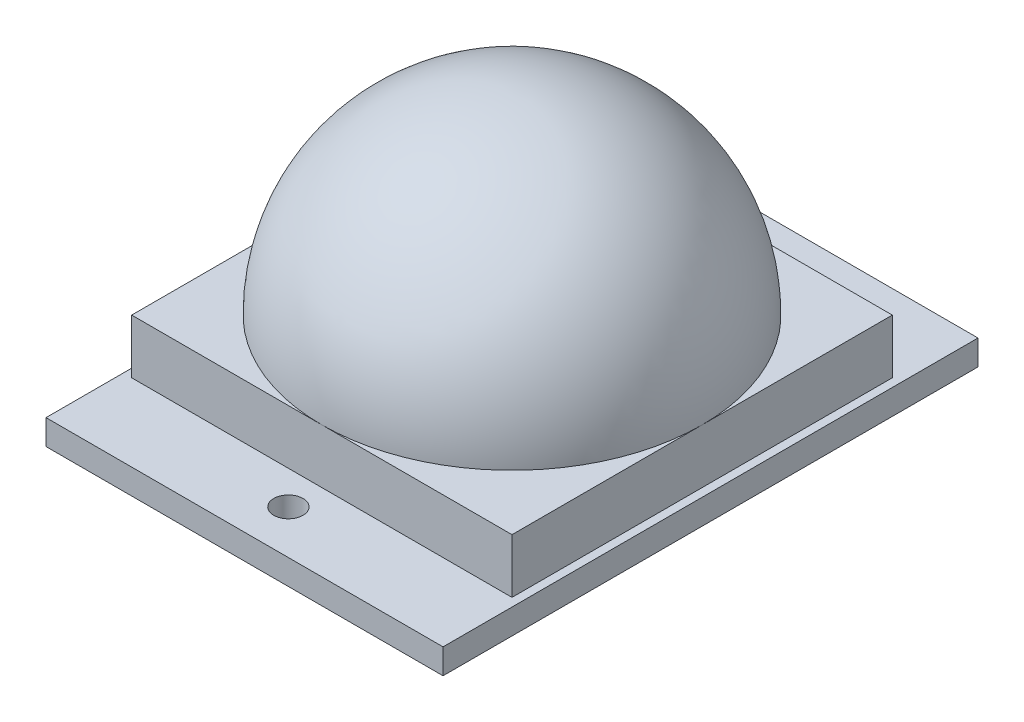
ISO-10303-21;
HEADER;
FILE_DESCRIPTION(('STEP AP214'),'2;1');
FILE_NAME('part.step','',(''),(''),'','','');
FILE_SCHEMA(('AUTOMOTIVE_DESIGN { 1 0 10303 214 1 1 1 1 }'));
ENDSEC;
DATA;
#1=APPLICATION_CONTEXT('core data for automotive mechanical design processes');
#2=APPLICATION_PROTOCOL_DEFINITION('international standard','automotive_design',2000,#1);
#3=PRODUCT_CONTEXT('',#1,'mechanical');
#4=PRODUCT('Part','Part','',(#3));
#5=PRODUCT_RELATED_PRODUCT_CATEGORY('part','',(#4));
#6=PRODUCT_DEFINITION_FORMATION('','',#4);
#7=PRODUCT_DEFINITION_CONTEXT('part definition',#1,'design');
#8=PRODUCT_DEFINITION('design','',#6,#7);
#9=PRODUCT_DEFINITION_SHAPE('','',#8);
#10=(LENGTH_UNIT() NAMED_UNIT(*) SI_UNIT(.MILLI.,.METRE.));
#11=(NAMED_UNIT(*) PLANE_ANGLE_UNIT() SI_UNIT($,.RADIAN.));
#12=(NAMED_UNIT(*) SI_UNIT($,.STERADIAN.) SOLID_ANGLE_UNIT());
#13=UNCERTAINTY_MEASURE_WITH_UNIT(LENGTH_MEASURE(1.E-05),#10,'distance_accuracy_value','');
#14=(GEOMETRIC_REPRESENTATION_CONTEXT(3) GLOBAL_UNCERTAINTY_ASSIGNED_CONTEXT((#13)) GLOBAL_UNIT_ASSIGNED_CONTEXT((#10,
#11,#12)) REPRESENTATION_CONTEXT('',''));
#15=CARTESIAN_POINT('',(0.,0.,0.));
#16=DIRECTION('',(0.,0.,1.));
#17=DIRECTION('',(1.,0.,0.));
#18=AXIS2_PLACEMENT_3D('',#15,#16,#17);
#19=CARTESIAN_POINT('',(0.,4.826,0.));
#20=DIRECTION('',(0.,-1.,0.));
#21=DIRECTION('',(0.,0.,-1.));
#22=AXIS2_PLACEMENT_3D('',#19,#20,#21);
#23=PLANE('',#22);
#24=CARTESIAN_POINT('',(0.,4.826,0.));
#25=DIRECTION('',(0.,-1.,0.));
#26=DIRECTION('',(0.,0.,-1.));
#27=AXIS2_PLACEMENT_3D('',#24,#25,#26);
#28=CIRCLE('',#27,11.557);
#29=CARTESIAN_POINT('',(0.,4.826,-11.557));
#30=VERTEX_POINT('',#29);
#31=CARTESIAN_POINT('',(-11.557,4.826,0.));
#32=VERTEX_POINT('',#31);
#33=EDGE_CURVE('E11',#30,#32,#28,.F.);
#34=ORIENTED_EDGE('',*,*,#33,.F.);
#35=DIRECTION('',(-1.,0.,0.));
#36=VECTOR('',#35,1.);
#37=CARTESIAN_POINT('',(11.557,4.826,-11.557));
#38=LINE('',#37,#36);
#39=CARTESIAN_POINT('',(-11.557,4.826,-11.557));
#40=VERTEX_POINT('',#39);
#41=EDGE_CURVE('E119',#30,#40,#38,.T.);
#42=ORIENTED_EDGE('',*,*,#41,.T.);
#43=DIRECTION('',(0.,0.,1.));
#44=VECTOR('',#43,1.);
#45=CARTESIAN_POINT('',(-11.557,4.826,-11.557));
#46=LINE('',#45,#44);
#47=EDGE_CURVE('E130',#40,#32,#46,.T.);
#48=ORIENTED_EDGE('',*,*,#47,.T.);
#49=EDGE_LOOP('',(#34,#42,#48));
#50=FACE_BOUND('',#49,.T.);
#51=ADVANCED_FACE('F35',(#50),#23,.F.);
#52=CARTESIAN_POINT('',(0.,4.826,11.557));
#53=VERTEX_POINT('',#52);
#54=EDGE_CURVE('E43',#32,#53,#28,.F.);
#55=ORIENTED_EDGE('',*,*,#54,.F.);
#56=CARTESIAN_POINT('',(-11.557,4.826,11.557));
#57=VERTEX_POINT('',#56);
#58=EDGE_CURVE('E149',#32,#57,#46,.T.);
#59=ORIENTED_EDGE('',*,*,#58,.T.);
#60=DIRECTION('',(1.,0.,0.));
#61=VECTOR('',#60,1.);
#62=CARTESIAN_POINT('',(11.557,4.826,11.557));
#63=LINE('',#62,#61);
#64=EDGE_CURVE('E150',#57,#53,#63,.T.);
#65=ORIENTED_EDGE('',*,*,#64,.T.);
#66=EDGE_LOOP('',(#55,#59,#65));
#67=FACE_BOUND('',#66,.T.);
#68=ADVANCED_FACE('F202',(#67),#23,.F.);
#69=CARTESIAN_POINT('',(11.557,4.826,0.));
#70=VERTEX_POINT('',#69);
#71=EDGE_CURVE('E44',#53,#70,#28,.F.);
#72=ORIENTED_EDGE('',*,*,#71,.F.);
#73=CARTESIAN_POINT('',(11.557,4.826,11.557));
#74=VERTEX_POINT('',#73);
#75=EDGE_CURVE('E148',#53,#74,#63,.T.);
#76=ORIENTED_EDGE('',*,*,#75,.T.);
#77=DIRECTION('',(0.,0.,-1.));
#78=VECTOR('',#77,1.);
#79=CARTESIAN_POINT('',(11.557,4.826,-11.557));
#80=LINE('',#79,#78);
#81=EDGE_CURVE('E129',#74,#70,#80,.T.);
#82=ORIENTED_EDGE('',*,*,#81,.T.);
#83=EDGE_LOOP('',(#72,#76,#82));
#84=FACE_BOUND('',#83,.T.);
#85=ADVANCED_FACE('F211',(#84),#23,.F.);
#86=CARTESIAN_POINT('',(0.,1.524,0.));
#87=DIRECTION('',(0.,-1.,0.));
#88=DIRECTION('',(0.,0.,-1.));
#89=AXIS2_PLACEMENT_3D('',#86,#87,#88);
#90=PLANE('',#89);
#91=CARTESIAN_POINT('',(0.,1.524,13.589));
#92=DIRECTION('',(0.,1.,0.));
#93=DIRECTION('',(0.,0.,1.));
#94=AXIS2_PLACEMENT_3D('',#91,#92,#93);
#95=CIRCLE('',#94,0.888999999999999);
#96=CARTESIAN_POINT('',(0.,1.524,14.478));
#97=VERTEX_POINT('',#96);
#98=EDGE_CURVE('E141',#97,#97,#95,.T.);
#99=ORIENTED_EDGE('',*,*,#98,.F.);
#100=EDGE_LOOP('',(#99));
#101=FACE_BOUND('',#100,.T.);
#102=CARTESIAN_POINT('',(0.,1.524,-13.589));
#103=DIRECTION('',(0.,1.,0.));
#104=DIRECTION('',(0.,0.,1.));
#105=AXIS2_PLACEMENT_3D('',#102,#103,#104);
#106=CIRCLE('',#105,0.889000000000001);
#107=CARTESIAN_POINT('',(0.,1.524,-12.7));
#108=VERTEX_POINT('',#107);
#109=EDGE_CURVE('E145',#108,#108,#106,.T.);
#110=ORIENTED_EDGE('',*,*,#109,.F.);
#111=EDGE_LOOP('',(#110));
#112=FACE_BOUND('',#111,.T.);
#113=DIRECTION('',(0.,0.,-1.));
#114=VECTOR('',#113,1.);
#115=CARTESIAN_POINT('',(12.065,1.524,16.256));
#116=LINE('',#115,#114);
#117=CARTESIAN_POINT('',(12.065,1.524,16.256));
#118=VERTEX_POINT('',#117);
#119=CARTESIAN_POINT('',(12.065,1.524,-16.256));
#120=VERTEX_POINT('',#119);
#121=EDGE_CURVE('E171',#118,#120,#116,.T.);
#122=ORIENTED_EDGE('',*,*,#121,.T.);
#123=DIRECTION('',(-1.,0.,0.));
#124=VECTOR('',#123,1.);
#125=CARTESIAN_POINT('',(-12.065,1.524,-16.256));
#126=LINE('',#125,#124);
#127=CARTESIAN_POINT('',(-12.065,1.524,-16.256));
#128=VERTEX_POINT('',#127);
#129=EDGE_CURVE('E174',#120,#128,#126,.T.);
#130=ORIENTED_EDGE('',*,*,#129,.T.);
#131=DIRECTION('',(0.,0.,1.));
#132=VECTOR('',#131,1.);
#133=CARTESIAN_POINT('',(-12.065,1.524,16.256));
#134=LINE('',#133,#132);
#135=CARTESIAN_POINT('',(-12.065,1.524,16.256));
#136=VERTEX_POINT('',#135);
#137=EDGE_CURVE('E177',#128,#136,#134,.T.);
#138=ORIENTED_EDGE('',*,*,#137,.T.);
#139=DIRECTION('',(1.,0.,0.));
#140=VECTOR('',#139,1.);
#141=CARTESIAN_POINT('',(-12.065,1.524,16.256));
#142=LINE('',#141,#140);
#143=EDGE_CURVE('E179',#136,#118,#142,.T.);
#144=ORIENTED_EDGE('',*,*,#143,.T.);
#145=EDGE_LOOP('',(#122,#130,#138,#144));
#146=FACE_BOUND('',#145,.T.);
#147=DIRECTION('',(0.,0.,1.));
#148=VECTOR('',#147,1.);
#149=CARTESIAN_POINT('',(-11.557,1.524,-11.557));
#150=LINE('',#149,#148);
#151=CARTESIAN_POINT('',(-11.557,1.524,-11.557));
#152=VERTEX_POINT('',#151);
#153=CARTESIAN_POINT('',(-11.557,1.524,11.557));
#154=VERTEX_POINT('',#153);
#155=EDGE_CURVE('E134',#152,#154,#150,.T.);
#156=ORIENTED_EDGE('',*,*,#155,.F.);
#157=DIRECTION('',(-1.,0.,0.));
#158=VECTOR('',#157,1.);
#159=CARTESIAN_POINT('',(11.557,1.524,-11.557));
#160=LINE('',#159,#158);
#161=CARTESIAN_POINT('',(11.557,1.524,-11.557));
#162=VERTEX_POINT('',#161);
#163=EDGE_CURVE('E159',#162,#152,#160,.T.);
#164=ORIENTED_EDGE('',*,*,#163,.F.);
#165=DIRECTION('',(0.,0.,-1.));
#166=VECTOR('',#165,1.);
#167=CARTESIAN_POINT('',(11.557,1.524,-11.557));
#168=LINE('',#167,#166);
#169=CARTESIAN_POINT('',(11.557,1.524,11.557));
#170=VERTEX_POINT('',#169);
#171=EDGE_CURVE('E156',#170,#162,#168,.T.);
#172=ORIENTED_EDGE('',*,*,#171,.F.);
#173=DIRECTION('',(1.,0.,0.));
#174=VECTOR('',#173,1.);
#175=CARTESIAN_POINT('',(11.557,1.524,11.557));
#176=LINE('',#175,#174);
#177=EDGE_CURVE('E138',#154,#170,#176,.T.);
#178=ORIENTED_EDGE('',*,*,#177,.F.);
#179=EDGE_LOOP('',(#156,#164,#172,#178));
#180=FACE_BOUND('',#179,.T.);
#181=ADVANCED_FACE('F215',(#101,#112,#146,#180),#90,.F.);
#182=CARTESIAN_POINT('',(12.065,1.524,16.256));
#183=DIRECTION('',(-1.,0.,0.));
#184=DIRECTION('',(0.,0.,1.));
#185=AXIS2_PLACEMENT_3D('',#182,#183,#184);
#186=PLANE('',#185);
#187=DIRECTION('',(0.,0.,-1.));
#188=VECTOR('',#187,1.);
#189=CARTESIAN_POINT('',(12.065,0.,16.256));
#190=LINE('',#189,#188);
#191=CARTESIAN_POINT('',(12.065,0.,16.256));
#192=VERTEX_POINT('',#191);
#193=CARTESIAN_POINT('',(12.065,0.,-16.256));
#194=VERTEX_POINT('',#193);
#195=EDGE_CURVE('E170',#192,#194,#190,.T.);
#196=ORIENTED_EDGE('',*,*,#195,.T.);
#197=DIRECTION('',(0.,-1.,0.));
#198=VECTOR('',#197,1.);
#199=CARTESIAN_POINT('',(12.065,1.524,-16.256));
#200=LINE('',#199,#198);
#201=EDGE_CURVE('E196',#120,#194,#200,.T.);
#202=ORIENTED_EDGE('',*,*,#201,.F.);
#203=ORIENTED_EDGE('',*,*,#121,.F.);
#204=DIRECTION('',(0.,-1.,0.));
#205=VECTOR('',#204,1.);
#206=CARTESIAN_POINT('',(12.065,1.524,16.256));
#207=LINE('',#206,#205);
#208=EDGE_CURVE('E181',#118,#192,#207,.T.);
#209=ORIENTED_EDGE('',*,*,#208,.T.);
#210=EDGE_LOOP('',(#196,#202,#203,#209));
#211=FACE_BOUND('',#210,.T.);
#212=ADVANCED_FACE('F37',(#211),#186,.F.);
#213=CARTESIAN_POINT('',(-12.065,1.524,-16.256));
#214=DIRECTION('',(0.,0.,1.));
#215=DIRECTION('',(1.,0.,0.));
#216=AXIS2_PLACEMENT_3D('',#213,#214,#215);
#217=PLANE('',#216);
#218=DIRECTION('',(-1.,0.,0.));
#219=VECTOR('',#218,1.);
#220=CARTESIAN_POINT('',(-12.065,0.,-16.256));
#221=LINE('',#220,#219);
#222=CARTESIAN_POINT('',(-12.065,0.,-16.256));
#223=VERTEX_POINT('',#222);
#224=EDGE_CURVE('E184',#194,#223,#221,.T.);
#225=ORIENTED_EDGE('',*,*,#224,.T.);
#226=DIRECTION('',(0.,-1.,0.));
#227=VECTOR('',#226,1.);
#228=CARTESIAN_POINT('',(-12.065,1.524,-16.256));
#229=LINE('',#228,#227);
#230=EDGE_CURVE('E194',#128,#223,#229,.T.);
#231=ORIENTED_EDGE('',*,*,#230,.F.);
#232=ORIENTED_EDGE('',*,*,#129,.F.);
#233=ORIENTED_EDGE('',*,*,#201,.T.);
#234=EDGE_LOOP('',(#225,#231,#232,#233));
#235=FACE_BOUND('',#234,.T.);
#236=ADVANCED_FACE('F223',(#235),#217,.F.);
#237=CARTESIAN_POINT('',(-12.065,1.524,16.256));
#238=DIRECTION('',(1.,0.,0.));
#239=DIRECTION('',(0.,0.,-1.));
#240=AXIS2_PLACEMENT_3D('',#237,#238,#239);
#241=PLANE('',#240);
#242=DIRECTION('',(0.,0.,1.));
#243=VECTOR('',#242,1.);
#244=CARTESIAN_POINT('',(-12.065,0.,16.256));
#245=LINE('',#244,#243);
#246=CARTESIAN_POINT('',(-12.065,0.,16.256));
#247=VERTEX_POINT('',#246);
#248=EDGE_CURVE('E186',#223,#247,#245,.T.);
#249=ORIENTED_EDGE('',*,*,#248,.T.);
#250=DIRECTION('',(0.,-1.,0.));
#251=VECTOR('',#250,1.);
#252=CARTESIAN_POINT('',(-12.065,1.524,16.256));
#253=LINE('',#252,#251);
#254=EDGE_CURVE('E191',#136,#247,#253,.T.);
#255=ORIENTED_EDGE('',*,*,#254,.F.);
#256=ORIENTED_EDGE('',*,*,#137,.F.);
#257=ORIENTED_EDGE('',*,*,#230,.T.);
#258=EDGE_LOOP('',(#249,#255,#256,#257));
#259=FACE_BOUND('',#258,.T.);
#260=ADVANCED_FACE('F258',(#259),#241,.F.);
#261=CARTESIAN_POINT('',(-12.065,1.524,16.256));
#262=DIRECTION('',(0.,0.,-1.));
#263=DIRECTION('',(-1.,0.,0.));
#264=AXIS2_PLACEMENT_3D('',#261,#262,#263);
#265=PLANE('',#264);
#266=DIRECTION('',(1.,0.,0.));
#267=VECTOR('',#266,1.);
#268=CARTESIAN_POINT('',(-12.065,0.,16.256));
#269=LINE('',#268,#267);
#270=EDGE_CURVE('E175',#247,#192,#269,.T.);
#271=ORIENTED_EDGE('',*,*,#270,.T.);
#272=ORIENTED_EDGE('',*,*,#208,.F.);
#273=ORIENTED_EDGE('',*,*,#143,.F.);
#274=ORIENTED_EDGE('',*,*,#254,.T.);
#275=EDGE_LOOP('',(#271,#272,#273,#274));
#276=FACE_BOUND('',#275,.T.);
#277=ADVANCED_FACE('F253',(#276),#265,.F.);
#278=CARTESIAN_POINT('',(0.,0.,0.));
#279=DIRECTION('',(0.,-1.,0.));
#280=DIRECTION('',(0.,0.,-1.));
#281=AXIS2_PLACEMENT_3D('',#278,#279,#280);
#282=PLANE('',#281);
#283=CARTESIAN_POINT('',(0.,0.,13.589));
#284=DIRECTION('',(0.,1.,0.));
#285=DIRECTION('',(0.,0.,1.));
#286=AXIS2_PLACEMENT_3D('',#283,#284,#285);
#287=CIRCLE('',#286,0.888999999999999);
#288=CARTESIAN_POINT('',(0.,0.,14.478));
#289=VERTEX_POINT('',#288);
#290=EDGE_CURVE('E135',#289,#289,#287,.T.);
#291=ORIENTED_EDGE('',*,*,#290,.T.);
#292=EDGE_LOOP('',(#291));
#293=FACE_BOUND('',#292,.T.);
#294=CARTESIAN_POINT('',(0.,0.,-13.589));
#295=DIRECTION('',(0.,1.,0.));
#296=DIRECTION('',(0.,0.,1.));
#297=AXIS2_PLACEMENT_3D('',#294,#295,#296);
#298=CIRCLE('',#297,0.889000000000001);
#299=CARTESIAN_POINT('',(0.,0.,-12.7));
#300=VERTEX_POINT('',#299);
#301=EDGE_CURVE('E376',#300,#300,#298,.T.);
#302=ORIENTED_EDGE('',*,*,#301,.T.);
#303=EDGE_LOOP('',(#302));
#304=FACE_BOUND('',#303,.T.);
#305=ORIENTED_EDGE('',*,*,#195,.F.);
#306=ORIENTED_EDGE('',*,*,#270,.F.);
#307=ORIENTED_EDGE('',*,*,#248,.F.);
#308=ORIENTED_EDGE('',*,*,#224,.F.);
#309=EDGE_LOOP('',(#305,#306,#307,#308));
#310=FACE_BOUND('',#309,.T.);
#311=ADVANCED_FACE('F249',(#293,#304,#310),#282,.T.);
#312=CARTESIAN_POINT('',(-11.557,4.826,-11.557));
#313=DIRECTION('',(1.,0.,0.));
#314=DIRECTION('',(0.,0.,-1.));
#315=AXIS2_PLACEMENT_3D('',#312,#313,#314);
#316=PLANE('',#315);
#317=ORIENTED_EDGE('',*,*,#155,.T.);
#318=DIRECTION('',(0.,-1.,0.));
#319=VECTOR('',#318,1.);
#320=CARTESIAN_POINT('',(-11.557,4.826,11.557));
#321=LINE('',#320,#319);
#322=EDGE_CURVE('E167',#57,#154,#321,.T.);
#323=ORIENTED_EDGE('',*,*,#322,.F.);
#324=ORIENTED_EDGE('',*,*,#58,.F.);
#325=ORIENTED_EDGE('',*,*,#47,.F.);
#326=DIRECTION('',(0.,-1.,0.));
#327=VECTOR('',#326,1.);
#328=CARTESIAN_POINT('',(-11.557,4.826,-11.557));
#329=LINE('',#328,#327);
#330=EDGE_CURVE('E118',#40,#152,#329,.T.);
#331=ORIENTED_EDGE('',*,*,#330,.T.);
#332=EDGE_LOOP('',(#317,#323,#324,#325,#331));
#333=FACE_BOUND('',#332,.T.);
#334=ADVANCED_FACE('F206',(#333),#316,.F.);
#335=CARTESIAN_POINT('',(11.557,4.826,11.557));
#336=DIRECTION('',(0.,0.,-1.));
#337=DIRECTION('',(-1.,0.,0.));
#338=AXIS2_PLACEMENT_3D('',#335,#336,#337);
#339=PLANE('',#338);
#340=ORIENTED_EDGE('',*,*,#177,.T.);
#341=DIRECTION('',(0.,-1.,0.));
#342=VECTOR('',#341,1.);
#343=CARTESIAN_POINT('',(11.557,4.826,11.557));
#344=LINE('',#343,#342);
#345=EDGE_CURVE('E164',#74,#170,#344,.T.);
#346=ORIENTED_EDGE('',*,*,#345,.F.);
#347=ORIENTED_EDGE('',*,*,#75,.F.);
#348=ORIENTED_EDGE('',*,*,#64,.F.);
#349=ORIENTED_EDGE('',*,*,#322,.T.);
#350=EDGE_LOOP('',(#340,#346,#347,#348,#349));
#351=FACE_BOUND('',#350,.T.);
#352=ADVANCED_FACE('F208',(#351),#339,.F.);
#353=CARTESIAN_POINT('',(11.557,4.826,-11.557));
#354=DIRECTION('',(-1.,0.,0.));
#355=DIRECTION('',(0.,0.,1.));
#356=AXIS2_PLACEMENT_3D('',#353,#354,#355);
#357=PLANE('',#356);
#358=ORIENTED_EDGE('',*,*,#171,.T.);
#359=DIRECTION('',(0.,-1.,0.));
#360=VECTOR('',#359,1.);
#361=CARTESIAN_POINT('',(11.557,4.826,-11.557));
#362=LINE('',#361,#360);
#363=CARTESIAN_POINT('',(11.557,4.826,-11.557));
#364=VERTEX_POINT('',#363);
#365=EDGE_CURVE('E162',#364,#162,#362,.T.);
#366=ORIENTED_EDGE('',*,*,#365,.F.);
#367=EDGE_CURVE('E114',#70,#364,#80,.T.);
#368=ORIENTED_EDGE('',*,*,#367,.F.);
#369=ORIENTED_EDGE('',*,*,#81,.F.);
#370=ORIENTED_EDGE('',*,*,#345,.T.);
#371=EDGE_LOOP('',(#358,#366,#368,#369,#370));
#372=FACE_BOUND('',#371,.T.);
#373=ADVANCED_FACE('F213',(#372),#357,.F.);
#374=CARTESIAN_POINT('',(11.557,4.826,-11.557));
#375=DIRECTION('',(0.,0.,1.));
#376=DIRECTION('',(1.,0.,0.));
#377=AXIS2_PLACEMENT_3D('',#374,#375,#376);
#378=PLANE('',#377);
#379=ORIENTED_EDGE('',*,*,#163,.T.);
#380=ORIENTED_EDGE('',*,*,#330,.F.);
#381=ORIENTED_EDGE('',*,*,#41,.F.);
#382=EDGE_CURVE('E111',#364,#30,#38,.T.);
#383=ORIENTED_EDGE('',*,*,#382,.F.);
#384=ORIENTED_EDGE('',*,*,#365,.T.);
#385=EDGE_LOOP('',(#379,#380,#381,#383,#384));
#386=FACE_BOUND('',#385,.T.);
#387=ADVANCED_FACE('F124',(#386),#378,.F.);
#388=CARTESIAN_POINT('',(0.,4.826,0.));
#389=DIRECTION('',(0.,-1.,0.));
#390=DIRECTION('',(0.,0.,-1.));
#391=AXIS2_PLACEMENT_3D('',#388,#389,#390);
#392=CIRCLE('',#391,11.557);
#393=EDGE_CURVE('E51',#30,#70,#392,.T.);
#394=ORIENTED_EDGE('',*,*,#393,.T.);
#395=ORIENTED_EDGE('',*,*,#367,.T.);
#396=ORIENTED_EDGE('',*,*,#382,.T.);
#397=EDGE_LOOP('',(#394,#395,#396));
#398=FACE_BOUND('',#397,.T.);
#399=ADVANCED_FACE('F113',(#398),#23,.F.);
#400=CARTESIAN_POINT('',(0.,4.826,0.));
#401=DIRECTION('',(0.,-1.,0.));
#402=DIRECTION('',(0.,0.,1.));
#403=AXIS2_PLACEMENT_3D('',#400,#401,#402);
#404=SPHERICAL_SURFACE('',#403,11.557);
#405=ORIENTED_EDGE('',*,*,#393,.F.);
#406=ORIENTED_EDGE('',*,*,#33,.T.);
#407=ORIENTED_EDGE('',*,*,#54,.T.);
#408=ORIENTED_EDGE('',*,*,#71,.T.);
#409=EDGE_LOOP('',(#405,#406,#407,#408));
#410=FACE_BOUND('',#409,.T.);
#411=ADVANCED_FACE('F133',(#410),#404,.T.);
#412=CARTESIAN_POINT('',(0.,0.,-13.589));
#413=DIRECTION('',(0.,1.,0.));
#414=DIRECTION('',(0.,0.,1.));
#415=AXIS2_PLACEMENT_3D('',#412,#413,#414);
#416=CYLINDRICAL_SURFACE('',#415,0.889000000000001);
#417=CARTESIAN_POINT('',(0.,0.,-12.7));
#418=CARTESIAN_POINT('',(0.,0.015875,-12.7));
#419=CARTESIAN_POINT('',(0.,0.03175,-12.7));
#420=CARTESIAN_POINT('',(0.,0.0635,-12.7));
#421=CARTESIAN_POINT('',(0.,0.079375,-12.7));
#422=CARTESIAN_POINT('',(0.,0.111125,-12.7));
#423=CARTESIAN_POINT('',(0.,0.127,-12.7));
#424=CARTESIAN_POINT('',(0.,0.15875,-12.7));
#425=CARTESIAN_POINT('',(0.,0.174625,-12.7));
#426=CARTESIAN_POINT('',(0.,0.206375,-12.7));
#427=CARTESIAN_POINT('',(0.,0.22225,-12.7));
#428=CARTESIAN_POINT('',(0.,0.254,-12.7));
#429=CARTESIAN_POINT('',(0.,0.269875,-12.7));
#430=CARTESIAN_POINT('',(0.,0.301625,-12.7));
#431=CARTESIAN_POINT('',(0.,0.3175,-12.7));
#432=CARTESIAN_POINT('',(0.,0.34925,-12.7));
#433=CARTESIAN_POINT('',(0.,0.365125,-12.7));
#434=CARTESIAN_POINT('',(0.,0.396875,-12.7));
#435=CARTESIAN_POINT('',(0.,0.41275,-12.7));
#436=CARTESIAN_POINT('',(0.,0.4445,-12.7));
#437=CARTESIAN_POINT('',(0.,0.460375,-12.7));
#438=CARTESIAN_POINT('',(0.,0.492125,-12.7));
#439=CARTESIAN_POINT('',(0.,0.508,-12.7));
#440=CARTESIAN_POINT('',(0.,0.53975,-12.7));
#441=CARTESIAN_POINT('',(0.,0.555625,-12.7));
#442=CARTESIAN_POINT('',(0.,0.587375,-12.7));
#443=CARTESIAN_POINT('',(0.,0.60325,-12.7));
#444=CARTESIAN_POINT('',(0.,0.635,-12.7));
#445=CARTESIAN_POINT('',(0.,0.650875,-12.7));
#446=CARTESIAN_POINT('',(0.,0.682625,-12.7));
#447=CARTESIAN_POINT('',(0.,0.6985,-12.7));
#448=CARTESIAN_POINT('',(0.,0.73025,-12.7));
#449=CARTESIAN_POINT('',(0.,0.746125,-12.7));
#450=CARTESIAN_POINT('',(0.,0.777875,-12.7));
#451=CARTESIAN_POINT('',(0.,0.79375,-12.7));
#452=CARTESIAN_POINT('',(0.,0.8255,-12.7));
#453=CARTESIAN_POINT('',(0.,0.841375,-12.7));
#454=CARTESIAN_POINT('',(0.,0.873125,-12.7));
#455=CARTESIAN_POINT('',(0.,0.889,-12.7));
#456=CARTESIAN_POINT('',(0.,0.92075,-12.7));
#457=CARTESIAN_POINT('',(0.,0.936625,-12.7));
#458=CARTESIAN_POINT('',(0.,0.968375,-12.7));
#459=CARTESIAN_POINT('',(0.,0.98425,-12.7));
#460=CARTESIAN_POINT('',(0.,1.016,-12.7));
#461=CARTESIAN_POINT('',(0.,1.031875,-12.7));
#462=CARTESIAN_POINT('',(0.,1.063625,-12.7));
#463=CARTESIAN_POINT('',(0.,1.0795,-12.7));
#464=CARTESIAN_POINT('',(0.,1.11125,-12.7));
#465=CARTESIAN_POINT('',(0.,1.127125,-12.7));
#466=CARTESIAN_POINT('',(0.,1.158875,-12.7));
#467=CARTESIAN_POINT('',(0.,1.17475,-12.7));
#468=CARTESIAN_POINT('',(0.,1.2065,-12.7));
#469=CARTESIAN_POINT('',(0.,1.222375,-12.7));
#470=CARTESIAN_POINT('',(0.,1.254125,-12.7));
#471=CARTESIAN_POINT('',(0.,1.27,-12.7));
#472=CARTESIAN_POINT('',(0.,1.30175,-12.7));
#473=CARTESIAN_POINT('',(0.,1.317625,-12.7));
#474=CARTESIAN_POINT('',(0.,1.349375,-12.7));
#475=CARTESIAN_POINT('',(0.,1.36525,-12.7));
#476=CARTESIAN_POINT('',(0.,1.397,-12.7));
#477=CARTESIAN_POINT('',(0.,1.412875,-12.7));
#478=CARTESIAN_POINT('',(0.,1.444625,-12.7));
#479=CARTESIAN_POINT('',(0.,1.4605,-12.7));
#480=CARTESIAN_POINT('',(0.,1.49225,-12.7));
#481=CARTESIAN_POINT('',(0.,1.508125,-12.7));
#482=CARTESIAN_POINT('',(0.,1.524,-12.7));
#483=B_SPLINE_CURVE_WITH_KNOTS('',3,(#417,#418,#419,#420,#421,#422,#423,#424,#425,#426,#427,
#428,#429,#430,#431,#432,#433,#434,#435,#436,#437,#438,#439,#440,#441,#442,#443,#444,#445,#446,
#447,#448,#449,#450,#451,#452,#453,#454,#455,#456,#457,#458,#459,#460,#461,#462,#463,#464,#465,
#466,#467,#468,#469,#470,#471,#472,#473,#474,#475,#476,#477,#478,#479,#480,#481,#482),
.UNSPECIFIED.,.F.,.F.,(4,2,2,2,2,2,2,2,2,2,2,2,2,2,2,2,2,2,2,2,2,2,2,2,2,2,2,2,2,2,2,2,4),(0.,
0.047625,0.09525,0.142875,0.1905,0.238125,0.28575,0.333375,0.381,0.428625,0.47625,0.523875,
0.5715,0.619125,0.66675,0.714375,0.762,0.809625,0.85725,0.904875,0.9525,1.000125,1.04775,
1.095375,1.143,1.190625,1.23825,1.285875,1.3335,1.381125,1.42875,1.476375,1.524),.UNSPECIFIED.);
#484=EDGE_CURVE('BSEAM241',#300,#108,#483,.T.);
#485=ORIENTED_EDGE('',*,*,#301,.F.);
#486=ORIENTED_EDGE('',*,*,#109,.T.);
#487=ORIENTED_EDGE('',*,*,#484,.T.);
#488=ORIENTED_EDGE('',*,*,#484,.F.);
#489=EDGE_LOOP('',(#485,#487,#486,#488));
#490=FACE_BOUND('',#489,.T.);
#491=ADVANCED_FACE('F241',(#490),#416,.F.);
#492=CARTESIAN_POINT('',(0.,0.,13.589));
#493=DIRECTION('',(0.,1.,0.));
#494=DIRECTION('',(0.,0.,1.));
#495=AXIS2_PLACEMENT_3D('',#492,#493,#494);
#496=CYLINDRICAL_SURFACE('',#495,0.888999999999999);
#497=CARTESIAN_POINT('',(0.,0.,14.478));
#498=CARTESIAN_POINT('',(0.,0.015875,14.478));
#499=CARTESIAN_POINT('',(0.,0.03175,14.478));
#500=CARTESIAN_POINT('',(0.,0.0635,14.478));
#501=CARTESIAN_POINT('',(0.,0.079375,14.478));
#502=CARTESIAN_POINT('',(0.,0.111125,14.478));
#503=CARTESIAN_POINT('',(0.,0.127,14.478));
#504=CARTESIAN_POINT('',(0.,0.15875,14.478));
#505=CARTESIAN_POINT('',(0.,0.174625,14.478));
#506=CARTESIAN_POINT('',(0.,0.206375,14.478));
#507=CARTESIAN_POINT('',(0.,0.22225,14.478));
#508=CARTESIAN_POINT('',(0.,0.254,14.478));
#509=CARTESIAN_POINT('',(0.,0.269875,14.478));
#510=CARTESIAN_POINT('',(0.,0.301625,14.478));
#511=CARTESIAN_POINT('',(0.,0.3175,14.478));
#512=CARTESIAN_POINT('',(0.,0.34925,14.478));
#513=CARTESIAN_POINT('',(0.,0.365125,14.478));
#514=CARTESIAN_POINT('',(0.,0.396875,14.478));
#515=CARTESIAN_POINT('',(0.,0.41275,14.478));
#516=CARTESIAN_POINT('',(0.,0.4445,14.478));
#517=CARTESIAN_POINT('',(0.,0.460375,14.478));
#518=CARTESIAN_POINT('',(0.,0.492125,14.478));
#519=CARTESIAN_POINT('',(0.,0.508,14.478));
#520=CARTESIAN_POINT('',(0.,0.53975,14.478));
#521=CARTESIAN_POINT('',(0.,0.555625,14.478));
#522=CARTESIAN_POINT('',(0.,0.587375,14.478));
#523=CARTESIAN_POINT('',(0.,0.60325,14.478));
#524=CARTESIAN_POINT('',(0.,0.635,14.478));
#525=CARTESIAN_POINT('',(0.,0.650875,14.478));
#526=CARTESIAN_POINT('',(0.,0.682625,14.478));
#527=CARTESIAN_POINT('',(0.,0.6985,14.478));
#528=CARTESIAN_POINT('',(0.,0.73025,14.478));
#529=CARTESIAN_POINT('',(0.,0.746125,14.478));
#530=CARTESIAN_POINT('',(0.,0.777875,14.478));
#531=CARTESIAN_POINT('',(0.,0.79375,14.478));
#532=CARTESIAN_POINT('',(0.,0.8255,14.478));
#533=CARTESIAN_POINT('',(0.,0.841375,14.478));
#534=CARTESIAN_POINT('',(0.,0.873125,14.478));
#535=CARTESIAN_POINT('',(0.,0.889,14.478));
#536=CARTESIAN_POINT('',(0.,0.92075,14.478));
#537=CARTESIAN_POINT('',(0.,0.936625,14.478));
#538=CARTESIAN_POINT('',(0.,0.968375,14.478));
#539=CARTESIAN_POINT('',(0.,0.98425,14.478));
#540=CARTESIAN_POINT('',(0.,1.016,14.478));
#541=CARTESIAN_POINT('',(0.,1.031875,14.478));
#542=CARTESIAN_POINT('',(0.,1.063625,14.478));
#543=CARTESIAN_POINT('',(0.,1.0795,14.478));
#544=CARTESIAN_POINT('',(0.,1.11125,14.478));
#545=CARTESIAN_POINT('',(0.,1.127125,14.478));
#546=CARTESIAN_POINT('',(0.,1.158875,14.478));
#547=CARTESIAN_POINT('',(0.,1.17475,14.478));
#548=CARTESIAN_POINT('',(0.,1.2065,14.478));
#549=CARTESIAN_POINT('',(0.,1.222375,14.478));
#550=CARTESIAN_POINT('',(0.,1.254125,14.478));
#551=CARTESIAN_POINT('',(0.,1.27,14.478));
#552=CARTESIAN_POINT('',(0.,1.30175,14.478));
#553=CARTESIAN_POINT('',(0.,1.317625,14.478));
#554=CARTESIAN_POINT('',(0.,1.349375,14.478));
#555=CARTESIAN_POINT('',(0.,1.36525,14.478));
#556=CARTESIAN_POINT('',(0.,1.397,14.478));
#557=CARTESIAN_POINT('',(0.,1.412875,14.478));
#558=CARTESIAN_POINT('',(0.,1.444625,14.478));
#559=CARTESIAN_POINT('',(0.,1.4605,14.478));
#560=CARTESIAN_POINT('',(0.,1.49225,14.478));
#561=CARTESIAN_POINT('',(0.,1.508125,14.478));
#562=CARTESIAN_POINT('',(0.,1.524,14.478));
#563=B_SPLINE_CURVE_WITH_KNOTS('',3,(#497,#498,#499,#500,#501,#502,#503,#504,#505,#506,#507,
#508,#509,#510,#511,#512,#513,#514,#515,#516,#517,#518,#519,#520,#521,#522,#523,#524,#525,#526,
#527,#528,#529,#530,#531,#532,#533,#534,#535,#536,#537,#538,#539,#540,#541,#542,#543,#544,#545,
#546,#547,#548,#549,#550,#551,#552,#553,#554,#555,#556,#557,#558,#559,#560,#561,#562),
.UNSPECIFIED.,.F.,.F.,(4,2,2,2,2,2,2,2,2,2,2,2,2,2,2,2,2,2,2,2,2,2,2,2,2,2,2,2,2,2,2,2,4),(0.,
0.047625,0.09525,0.142875,0.1905,0.238125,0.28575,0.333375,0.381,0.428625,0.47625,0.523875,
0.5715,0.619125,0.66675,0.714375,0.762,0.809625,0.85725,0.904875,0.9525,1.000125,1.04775,
1.095375,1.143,1.190625,1.23825,1.285875,1.3335,1.381125,1.42875,1.476375,1.524),.UNSPECIFIED.);
#564=EDGE_CURVE('BSEAM359',#289,#97,#563,.T.);
#565=ORIENTED_EDGE('',*,*,#290,.F.);
#566=ORIENTED_EDGE('',*,*,#98,.T.);
#567=ORIENTED_EDGE('',*,*,#564,.T.);
#568=ORIENTED_EDGE('',*,*,#564,.F.);
#569=EDGE_LOOP('',(#565,#567,#566,#568));
#570=FACE_BOUND('',#569,.T.);
#571=ADVANCED_FACE('F359',(#570),#496,.F.);
#572=CLOSED_SHELL('',(#51,#68,#85,#181,#212,#236,#260,#277,#311,#334,#352,#373,#387,#399,#411,
#491,#571));
#573=MANIFOLD_SOLID_BREP('B2',#572);
#574=ADVANCED_BREP_SHAPE_REPRESENTATION('',(#18,#573),#14);
#575=SHAPE_DEFINITION_REPRESENTATION(#9,#574);
ENDSEC;
END-ISO-10303-21;
